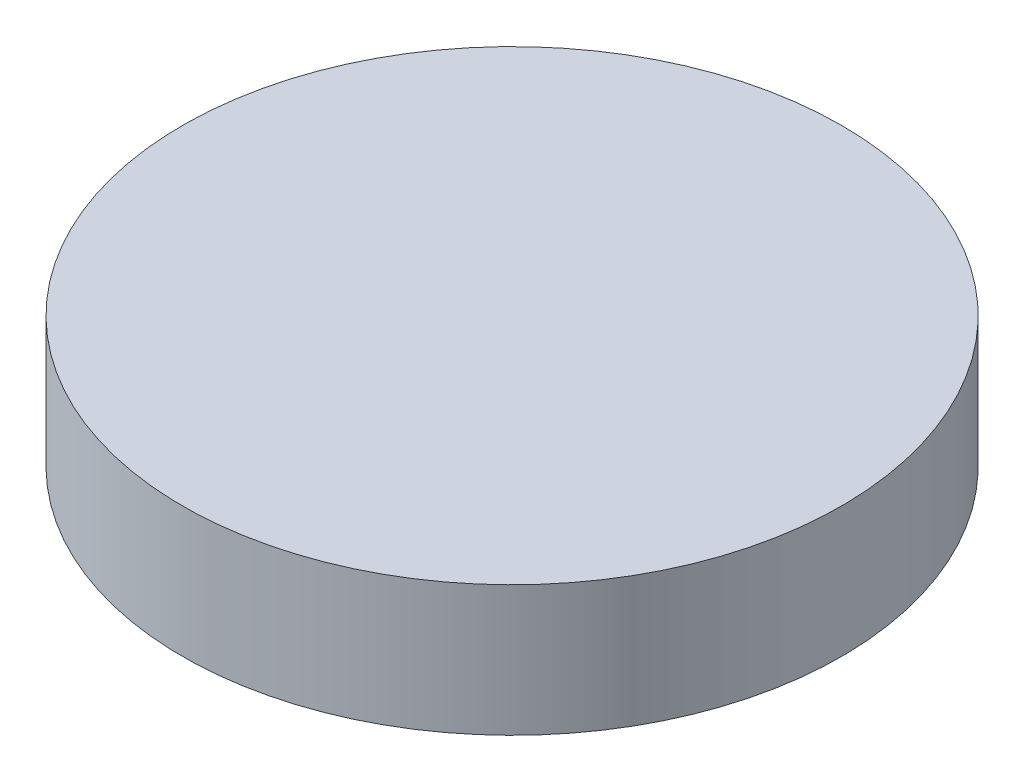
ISO-10303-21;
HEADER;
FILE_DESCRIPTION(('STEP AP214'),'2;1');
FILE_NAME('part.step','',(''),(''),'','','');
FILE_SCHEMA(('AUTOMOTIVE_DESIGN { 1 0 10303 214 1 1 1 1 }'));
ENDSEC;
DATA;
#1=APPLICATION_CONTEXT('core data for automotive mechanical design processes');
#2=APPLICATION_PROTOCOL_DEFINITION('international standard','automotive_design',2000,#1);
#3=PRODUCT_CONTEXT('',#1,'mechanical');
#4=PRODUCT('Part','Part','',(#3));
#5=PRODUCT_RELATED_PRODUCT_CATEGORY('part','',(#4));
#6=PRODUCT_DEFINITION_FORMATION('','',#4);
#7=PRODUCT_DEFINITION_CONTEXT('part definition',#1,'design');
#8=PRODUCT_DEFINITION('design','',#6,#7);
#9=PRODUCT_DEFINITION_SHAPE('','',#8);
#10=(LENGTH_UNIT() NAMED_UNIT(*) SI_UNIT(.MILLI.,.METRE.));
#11=(NAMED_UNIT(*) PLANE_ANGLE_UNIT() SI_UNIT($,.RADIAN.));
#12=(NAMED_UNIT(*) SI_UNIT($,.STERADIAN.) SOLID_ANGLE_UNIT());
#13=UNCERTAINTY_MEASURE_WITH_UNIT(LENGTH_MEASURE(1.E-05),#10,'distance_accuracy_value','');
#14=(GEOMETRIC_REPRESENTATION_CONTEXT(3) GLOBAL_UNCERTAINTY_ASSIGNED_CONTEXT((#13)) GLOBAL_UNIT_ASSIGNED_CONTEXT((#10,
#11,#12)) REPRESENTATION_CONTEXT('',''));
#15=CARTESIAN_POINT('',(0.,0.,0.));
#16=DIRECTION('',(0.,0.,1.));
#17=DIRECTION('',(1.,0.,0.));
#18=AXIS2_PLACEMENT_3D('',#15,#16,#17);
#19=CARTESIAN_POINT('',(122.851664201497,81.1772722169131,2.8034568351251));
#20=DIRECTION('',(0.,-1.,0.));
#21=DIRECTION('',(0.,0.,-1.));
#22=AXIS2_PLACEMENT_3D('',#19,#20,#21);
#23=PLANE('',#22);
#24=CARTESIAN_POINT('',(122.851664201497,81.1772722169131,2.8034568351251));
#25=DIRECTION('',(0.,-1.,0.));
#26=DIRECTION('',(-0.581108581114922,0.,-0.813826036051073));
#27=AXIS2_PLACEMENT_3D('',#24,#25,#26);
#28=CIRCLE('',#27,1.26377571234556);
#29=CARTESIAN_POINT('',(122.851664201497,81.1772722169131,1.53968112277954));
#30=VERTEX_POINT('',#29);
#31=EDGE_CURVE('E11',#30,#30,#28,.T.);
#32=ORIENTED_EDGE('',*,*,#31,.T.);
#33=EDGE_LOOP('',(#32));
#34=FACE_BOUND('',#33,.T.);
#35=ADVANCED_FACE('F38',(#34),#23,.T.);
#36=CARTESIAN_POINT('',(122.851664201497,81.6772722169131,2.8034568351251));
#37=DIRECTION('',(0.,1.,0.));
#38=DIRECTION('',(1.,0.,0.));
#39=AXIS2_PLACEMENT_3D('',#36,#37,#38);
#40=PLANE('',#39);
#41=CARTESIAN_POINT('',(122.851664201497,81.6772722169131,2.8034568351251));
#42=DIRECTION('',(0.,-1.,0.));
#43=DIRECTION('',(-0.581108581114922,0.,-0.813826036051073));
#44=AXIS2_PLACEMENT_3D('',#41,#42,#43);
#45=CIRCLE('',#44,1.26377571234556);
#46=CARTESIAN_POINT('',(122.851664201497,81.6772722169131,1.53968112277954));
#47=VERTEX_POINT('',#46);
#48=EDGE_CURVE('E55',#47,#47,#45,.T.);
#49=ORIENTED_EDGE('',*,*,#48,.F.);
#50=EDGE_LOOP('',(#49));
#51=FACE_BOUND('',#50,.T.);
#52=ADVANCED_FACE('F58',(#51),#40,.T.);
#53=CARTESIAN_POINT('',(122.851664201497,81.6772722169131,2.8034568351251));
#54=DIRECTION('',(0.,1.,0.));
#55=DIRECTION('',(0.,0.,1.));
#56=AXIS2_PLACEMENT_3D('',#53,#54,#55);
#57=CYLINDRICAL_SURFACE('',#56,1.26377571234556);
#58=ORIENTED_EDGE('',*,*,#48,.T.);
#59=DIRECTION('',(0.,-1.,0.));
#60=VECTOR('',#59,1.);
#61=CARTESIAN_POINT('',(122.851664201497,81.6772722169131,1.53968112277954));
#62=LINE('',#61,#60);
#63=EDGE_CURVE('E42',#47,#30,#62,.T.);
#64=ORIENTED_EDGE('',*,*,#63,.T.);
#65=ORIENTED_EDGE('',*,*,#31,.F.);
#66=ORIENTED_EDGE('',*,*,#63,.F.);
#67=EDGE_LOOP('',(#58,#64,#65,#66));
#68=FACE_BOUND('',#67,.T.);
#69=ADVANCED_FACE('F40',(#68),#57,.T.);
#70=CLOSED_SHELL('',(#35,#52,#69));
#71=MANIFOLD_SOLID_BREP('B2',#70);
#72=ADVANCED_BREP_SHAPE_REPRESENTATION('',(#18,#71),#14);
#73=SHAPE_DEFINITION_REPRESENTATION(#9,#72);
ENDSEC;
END-ISO-10303-21;
